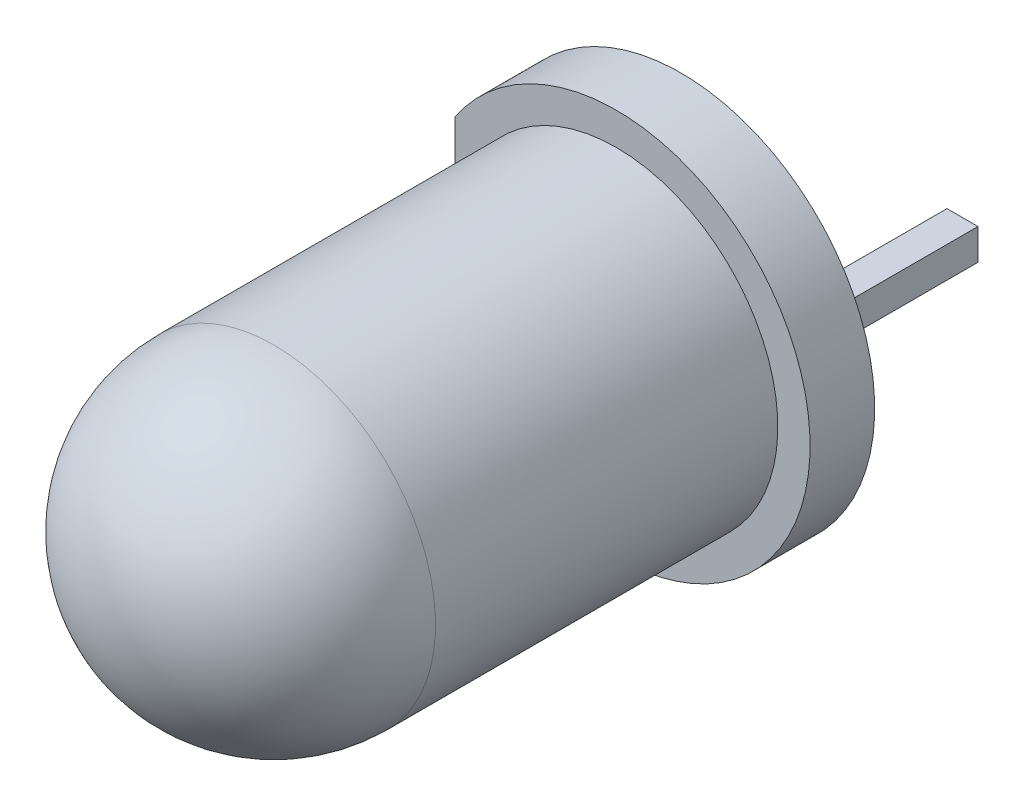
ISO-10303-21;
HEADER;
FILE_DESCRIPTION(('STEP AP214'),'2;1');
FILE_NAME('part.step','',(''),(''),'','','');
FILE_SCHEMA(('AUTOMOTIVE_DESIGN { 1 0 10303 214 1 1 1 1 }'));
ENDSEC;
DATA;
#1=APPLICATION_CONTEXT('core data for automotive mechanical design processes');
#2=APPLICATION_PROTOCOL_DEFINITION('international standard','automotive_design',2000,#1);
#3=PRODUCT_CONTEXT('',#1,'mechanical');
#4=PRODUCT('Part','Part','',(#3));
#5=PRODUCT_RELATED_PRODUCT_CATEGORY('part','',(#4));
#6=PRODUCT_DEFINITION_FORMATION('','',#4);
#7=PRODUCT_DEFINITION_CONTEXT('part definition',#1,'design');
#8=PRODUCT_DEFINITION('design','',#6,#7);
#9=PRODUCT_DEFINITION_SHAPE('','',#8);
#10=(LENGTH_UNIT() NAMED_UNIT(*) SI_UNIT(.MILLI.,.METRE.));
#11=(NAMED_UNIT(*) PLANE_ANGLE_UNIT() SI_UNIT($,.RADIAN.));
#12=(NAMED_UNIT(*) SI_UNIT($,.STERADIAN.) SOLID_ANGLE_UNIT());
#13=UNCERTAINTY_MEASURE_WITH_UNIT(LENGTH_MEASURE(1.E-05),#10,'distance_accuracy_value','');
#14=(GEOMETRIC_REPRESENTATION_CONTEXT(3) GLOBAL_UNCERTAINTY_ASSIGNED_CONTEXT((#13)) GLOBAL_UNIT_ASSIGNED_CONTEXT((#10,
#11,#12)) REPRESENTATION_CONTEXT('',''));
#15=CARTESIAN_POINT('',(0.,0.,0.));
#16=DIRECTION('',(0.,0.,1.));
#17=DIRECTION('',(1.,0.,0.));
#18=AXIS2_PLACEMENT_3D('',#15,#16,#17);
#19=CARTESIAN_POINT('',(-0.0499999999999997,0.,4.26666666666667));
#20=DIRECTION('',(0.,0.,1.));
#21=DIRECTION('',(-1.,0.,0.));
#22=AXIS2_PLACEMENT_3D('',#19,#20,#21);
#23=SPHERICAL_SURFACE('',#22,0.566666666666667);
#24=CARTESIAN_POINT('',(-0.0499999999999997,-0.24,4.26666666666667));
#25=DIRECTION('',(0.,1.,0.));
#26=DIRECTION('',(0.,0.,1.));
#27=AXIS2_PLACEMENT_3D('',#24,#25,#26);
#28=CIRCLE('',#27,0.513333333333333);
#29=CARTESIAN_POINT('',(-0.488634243989226,-0.24,4.));
#30=VERTEX_POINT('',#29);
#31=CARTESIAN_POINT('',(0.388634243989226,-0.24,4.));
#32=VERTEX_POINT('',#31);
#33=EDGE_CURVE('E161',#30,#32,#28,.F.);
#34=ORIENTED_EDGE('',*,*,#33,.T.);
#35=CARTESIAN_POINT('',(-0.0499999999999997,0.,4.));
#36=DIRECTION('',(0.,0.,1.));
#37=DIRECTION('',(1.,0.,0.));
#38=AXIS2_PLACEMENT_3D('',#35,#36,#37);
#39=CIRCLE('',#38,0.5);
#40=EDGE_CURVE('E56',#30,#32,#39,.T.);
#41=ORIENTED_EDGE('',*,*,#40,.F.);
#42=EDGE_LOOP('',(#34,#41));
#43=FACE_BOUND('',#42,.T.);
#44=ADVANCED_FACE('F48',(#43),#23,.T.);
#45=CARTESIAN_POINT('',(0.388634243989226,0.24,4.));
#46=VERTEX_POINT('',#45);
#47=CARTESIAN_POINT('',(-0.488634243989226,0.24,4.));
#48=VERTEX_POINT('',#47);
#49=EDGE_CURVE('E12',#46,#48,#39,.T.);
#50=ORIENTED_EDGE('',*,*,#49,.F.);
#51=CARTESIAN_POINT('',(-0.0499999999999997,0.24,4.26666666666667));
#52=DIRECTION('',(0.,1.,0.));
#53=DIRECTION('',(0.,0.,1.));
#54=AXIS2_PLACEMENT_3D('',#51,#52,#53);
#55=CIRCLE('',#54,0.513333333333333);
#56=EDGE_CURVE('E183',#48,#46,#55,.F.);
#57=ORIENTED_EDGE('',*,*,#56,.F.);
#58=EDGE_LOOP('',(#50,#57));
#59=FACE_BOUND('',#58,.T.);
#60=ADVANCED_FACE('F50',(#59),#23,.T.);
#61=CARTESIAN_POINT('',(-0.55,0.,4.));
#62=DIRECTION('',(0.,0.,-1.));
#63=DIRECTION('',(-1.,0.,0.));
#64=AXIS2_PLACEMENT_3D('',#61,#62,#63);
#65=PLANE('',#64);
#66=CARTESIAN_POINT('',(-0.0499999999999997,0.,4.));
#67=DIRECTION('',(0.,0.,1.));
#68=DIRECTION('',(1.,0.,0.));
#69=AXIS2_PLACEMENT_3D('',#66,#67,#68);
#70=CIRCLE('',#69,0.2);
#71=CARTESIAN_POINT('',(0.15,0.,4.));
#72=VERTEX_POINT('',#71);
#73=EDGE_CURVE('E256',#72,#72,#70,.T.);
#74=ORIENTED_EDGE('',*,*,#73,.F.);
#75=EDGE_LOOP('',(#74));
#76=FACE_BOUND('',#75,.T.);
#77=ORIENTED_EDGE('',*,*,#49,.T.);
#78=DIRECTION('',(1.,0.,0.));
#79=VECTOR('',#78,1.);
#80=CARTESIAN_POINT('',(-1.3,0.24,4.));
#81=LINE('',#80,#79);
#82=CARTESIAN_POINT('',(-1.3,0.24,4.));
#83=VERTEX_POINT('',#82);
#84=EDGE_CURVE('E102',#83,#48,#81,.T.);
#85=ORIENTED_EDGE('',*,*,#84,.F.);
#86=DIRECTION('',(0.,-1.,0.));
#87=VECTOR('',#86,1.);
#88=CARTESIAN_POINT('',(-1.3,0.24,4.));
#89=LINE('',#88,#87);
#90=CARTESIAN_POINT('',(-1.3,-0.24,4.));
#91=VERTEX_POINT('',#90);
#92=EDGE_CURVE('E160',#83,#91,#89,.T.);
#93=ORIENTED_EDGE('',*,*,#92,.T.);
#94=DIRECTION('',(1.,0.,0.));
#95=VECTOR('',#94,1.);
#96=CARTESIAN_POINT('',(-1.3,-0.24,4.));
#97=LINE('',#96,#95);
#98=EDGE_CURVE('E63',#91,#30,#97,.T.);
#99=ORIENTED_EDGE('',*,*,#98,.T.);
#100=ORIENTED_EDGE('',*,*,#40,.T.);
#101=CARTESIAN_POINT('',(1.2,-0.24,4.));
#102=VERTEX_POINT('',#101);
#103=EDGE_CURVE('E146',#32,#102,#97,.T.);
#104=ORIENTED_EDGE('',*,*,#103,.T.);
#105=DIRECTION('',(0.,-1.,0.));
#106=VECTOR('',#105,1.);
#107=CARTESIAN_POINT('',(1.2,0.24,4.));
#108=LINE('',#107,#106);
#109=CARTESIAN_POINT('',(1.2,0.24,4.));
#110=VERTEX_POINT('',#109);
#111=EDGE_CURVE('E130',#110,#102,#108,.T.);
#112=ORIENTED_EDGE('',*,*,#111,.F.);
#113=EDGE_CURVE('E118',#46,#110,#81,.T.);
#114=ORIENTED_EDGE('',*,*,#113,.F.);
#115=EDGE_LOOP('',(#77,#85,#93,#99,#100,#104,#112,#114));
#116=FACE_BOUND('',#115,.T.);
#117=ADVANCED_FACE('F166',(#76,#116),#65,.F.);
#118=CARTESIAN_POINT('',(0.,0.24,0.));
#119=DIRECTION('',(0.,1.,0.));
#120=DIRECTION('',(0.,0.,1.));
#121=AXIS2_PLACEMENT_3D('',#118,#119,#120);
#122=PLANE('',#121);
#123=ORIENTED_EDGE('',*,*,#84,.T.);
#124=ORIENTED_EDGE('',*,*,#56,.T.);
#125=ORIENTED_EDGE('',*,*,#113,.T.);
#126=DIRECTION('',(-0.508148861978286,0.,-0.861269257590315));
#127=VECTOR('',#126,1.);
#128=CARTESIAN_POINT('',(1.2,0.24,4.));
#129=LINE('',#128,#127);
#130=CARTESIAN_POINT('',(0.0199999999999998,0.24,2.));
#131=VERTEX_POINT('',#130);
#132=EDGE_CURVE('E109',#110,#131,#129,.T.);
#133=ORIENTED_EDGE('',*,*,#132,.T.);
#134=DIRECTION('',(-1.,0.,0.));
#135=VECTOR('',#134,1.);
#136=CARTESIAN_POINT('',(0.0199999999999998,0.24,2.));
#137=LINE('',#136,#135);
#138=CARTESIAN_POINT('',(-1.12,0.24,2.));
#139=VERTEX_POINT('',#138);
#140=EDGE_CURVE('E114',#131,#139,#137,.T.);
#141=ORIENTED_EDGE('',*,*,#140,.T.);
#142=DIRECTION('',(0.,0.,-1.));
#143=VECTOR('',#142,1.);
#144=CARTESIAN_POINT('',(-1.12,0.24,2.));
#145=LINE('',#144,#143);
#146=CARTESIAN_POINT('',(-1.12,0.24,-0.999999999999997));
#147=VERTEX_POINT('',#146);
#148=EDGE_CURVE('E136',#139,#147,#145,.T.);
#149=ORIENTED_EDGE('',*,*,#148,.T.);
#150=DIRECTION('',(1.,0.,0.));
#151=VECTOR('',#150,1.);
#152=CARTESIAN_POINT('',(-1.12,0.24,-0.999999999999997));
#153=LINE('',#152,#151);
#154=CARTESIAN_POINT('',(-1.6,0.24,-0.999999999999997));
#155=VERTEX_POINT('',#154);
#156=EDGE_CURVE('E147',#155,#147,#153,.T.);
#157=ORIENTED_EDGE('',*,*,#156,.F.);
#158=DIRECTION('',(0.,0.,1.));
#159=VECTOR('',#158,1.);
#160=CARTESIAN_POINT('',(-1.6,0.24,0.));
#161=LINE('',#160,#159);
#162=CARTESIAN_POINT('',(-1.6,0.24,3.5));
#163=VERTEX_POINT('',#162);
#164=EDGE_CURVE('E72',#155,#163,#161,.T.);
#165=ORIENTED_EDGE('',*,*,#164,.T.);
#166=DIRECTION('',(0.514495755427526,0.,0.857492925712544));
#167=VECTOR('',#166,1.);
#168=CARTESIAN_POINT('',(-1.6,0.24,3.5));
#169=LINE('',#168,#167);
#170=EDGE_CURVE('E156',#163,#83,#169,.T.);
#171=ORIENTED_EDGE('',*,*,#170,.T.);
#172=EDGE_LOOP('',(#123,#124,#125,#133,#141,#149,#157,#165,#171));
#173=FACE_BOUND('',#172,.T.);
#174=ADVANCED_FACE('F111',(#173),#122,.T.);
#175=CARTESIAN_POINT('',(0.,-0.24,0.));
#176=DIRECTION('',(0.,1.,0.));
#177=DIRECTION('',(0.,0.,1.));
#178=AXIS2_PLACEMENT_3D('',#175,#176,#177);
#179=PLANE('',#178);
#180=ORIENTED_EDGE('',*,*,#33,.F.);
#181=ORIENTED_EDGE('',*,*,#98,.F.);
#182=DIRECTION('',(0.514495755427526,0.,0.857492925712544));
#183=VECTOR('',#182,1.);
#184=CARTESIAN_POINT('',(-1.6,-0.24,3.5));
#185=LINE('',#184,#183);
#186=CARTESIAN_POINT('',(-1.6,-0.24,3.5));
#187=VERTEX_POINT('',#186);
#188=EDGE_CURVE('E143',#187,#91,#185,.T.);
#189=ORIENTED_EDGE('',*,*,#188,.F.);
#190=DIRECTION('',(0.,0.,1.));
#191=VECTOR('',#190,1.);
#192=CARTESIAN_POINT('',(-1.6,-0.24,0.));
#193=LINE('',#192,#191);
#194=CARTESIAN_POINT('',(-1.6,-0.24,-0.999999999999997));
#195=VERTEX_POINT('',#194);
#196=EDGE_CURVE('E96',#195,#187,#193,.T.);
#197=ORIENTED_EDGE('',*,*,#196,.F.);
#198=DIRECTION('',(-1.,0.,0.));
#199=VECTOR('',#198,1.);
#200=CARTESIAN_POINT('',(-1.12,-0.24,-0.999999999999997));
#201=LINE('',#200,#199);
#202=CARTESIAN_POINT('',(-1.12,-0.24,-0.999999999999997));
#203=VERTEX_POINT('',#202);
#204=EDGE_CURVE('E204',#203,#195,#201,.T.);
#205=ORIENTED_EDGE('',*,*,#204,.F.);
#206=DIRECTION('',(0.,0.,-1.));
#207=VECTOR('',#206,1.);
#208=CARTESIAN_POINT('',(-1.12,-0.24,2.));
#209=LINE('',#208,#207);
#210=CARTESIAN_POINT('',(-1.12,-0.24,2.));
#211=VERTEX_POINT('',#210);
#212=EDGE_CURVE('E152',#211,#203,#209,.T.);
#213=ORIENTED_EDGE('',*,*,#212,.F.);
#214=DIRECTION('',(-1.,0.,0.));
#215=VECTOR('',#214,1.);
#216=CARTESIAN_POINT('',(0.0199999999999998,-0.24,2.));
#217=LINE('',#216,#215);
#218=CARTESIAN_POINT('',(0.0199999999999998,-0.24,2.));
#219=VERTEX_POINT('',#218);
#220=EDGE_CURVE('E150',#219,#211,#217,.T.);
#221=ORIENTED_EDGE('',*,*,#220,.F.);
#222=DIRECTION('',(-0.508148861978286,0.,-0.861269257590315));
#223=VECTOR('',#222,1.);
#224=CARTESIAN_POINT('',(1.2,-0.24,4.));
#225=LINE('',#224,#223);
#226=EDGE_CURVE('E127',#102,#219,#225,.T.);
#227=ORIENTED_EDGE('',*,*,#226,.F.);
#228=ORIENTED_EDGE('',*,*,#103,.F.);
#229=EDGE_LOOP('',(#180,#181,#189,#197,#205,#213,#221,#227,#228));
#230=FACE_BOUND('',#229,.T.);
#231=ADVANCED_FACE('F218',(#230),#179,.F.);
#232=CARTESIAN_POINT('',(-1.6,0.24,3.5));
#233=DIRECTION('',(0.857492925712544,0.,-0.514495755427526));
#234=DIRECTION('',(-0.514495755427526,0.,-0.857492925712544));
#235=AXIS2_PLACEMENT_3D('',#232,#233,#234);
#236=PLANE('',#235);
#237=ORIENTED_EDGE('',*,*,#188,.T.);
#238=ORIENTED_EDGE('',*,*,#92,.F.);
#239=ORIENTED_EDGE('',*,*,#170,.F.);
#240=DIRECTION('',(0.,-1.,0.));
#241=VECTOR('',#240,1.);
#242=CARTESIAN_POINT('',(-1.6,0.24,3.5));
#243=LINE('',#242,#241);
#244=EDGE_CURVE('E142',#163,#187,#243,.T.);
#245=ORIENTED_EDGE('',*,*,#244,.T.);
#246=EDGE_LOOP('',(#237,#238,#239,#245));
#247=FACE_BOUND('',#246,.T.);
#248=ADVANCED_FACE('F215',(#247),#236,.F.);
#249=CARTESIAN_POINT('',(1.2,0.24,4.));
#250=DIRECTION('',(-0.861269257590315,0.,0.508148861978286));
#251=DIRECTION('',(0.508148861978286,0.,0.861269257590315));
#252=AXIS2_PLACEMENT_3D('',#249,#250,#251);
#253=PLANE('',#252);
#254=ORIENTED_EDGE('',*,*,#226,.T.);
#255=DIRECTION('',(0.,-1.,0.));
#256=VECTOR('',#255,1.);
#257=CARTESIAN_POINT('',(0.0199999999999998,0.24,2.));
#258=LINE('',#257,#256);
#259=EDGE_CURVE('E124',#131,#219,#258,.T.);
#260=ORIENTED_EDGE('',*,*,#259,.F.);
#261=ORIENTED_EDGE('',*,*,#132,.F.);
#262=ORIENTED_EDGE('',*,*,#111,.T.);
#263=EDGE_LOOP('',(#254,#260,#261,#262));
#264=FACE_BOUND('',#263,.T.);
#265=ADVANCED_FACE('F125',(#264),#253,.F.);
#266=CARTESIAN_POINT('',(0.0199999999999998,0.24,2.));
#267=DIRECTION('',(0.,0.,1.));
#268=DIRECTION('',(1.,0.,0.));
#269=AXIS2_PLACEMENT_3D('',#266,#267,#268);
#270=PLANE('',#269);
#271=ORIENTED_EDGE('',*,*,#220,.T.);
#272=DIRECTION('',(0.,-1.,0.));
#273=VECTOR('',#272,1.);
#274=CARTESIAN_POINT('',(-1.12,0.24,2.));
#275=LINE('',#274,#273);
#276=EDGE_CURVE('E131',#139,#211,#275,.T.);
#277=ORIENTED_EDGE('',*,*,#276,.F.);
#278=ORIENTED_EDGE('',*,*,#140,.F.);
#279=ORIENTED_EDGE('',*,*,#259,.T.);
#280=EDGE_LOOP('',(#271,#277,#278,#279));
#281=FACE_BOUND('',#280,.T.);
#282=ADVANCED_FACE('F133',(#281),#270,.F.);
#283=CARTESIAN_POINT('',(-1.12,0.24,2.));
#284=DIRECTION('',(-1.,0.,0.));
#285=DIRECTION('',(0.,0.,1.));
#286=AXIS2_PLACEMENT_3D('',#283,#284,#285);
#287=PLANE('',#286);
#288=ORIENTED_EDGE('',*,*,#212,.T.);
#289=DIRECTION('',(0.,-1.,0.));
#290=VECTOR('',#289,1.);
#291=CARTESIAN_POINT('',(-1.12,-0.24,-0.999999999999997));
#292=LINE('',#291,#290);
#293=EDGE_CURVE('E198',#147,#203,#292,.T.);
#294=ORIENTED_EDGE('',*,*,#293,.F.);
#295=ORIENTED_EDGE('',*,*,#148,.F.);
#296=ORIENTED_EDGE('',*,*,#276,.T.);
#297=EDGE_LOOP('',(#288,#294,#295,#296));
#298=FACE_BOUND('',#297,.T.);
#299=ADVANCED_FACE('F201',(#298),#287,.F.);
#300=CARTESIAN_POINT('',(-1.6,0.24,0.));
#301=DIRECTION('',(1.,0.,0.));
#302=DIRECTION('',(0.,0.,-1.));
#303=AXIS2_PLACEMENT_3D('',#300,#301,#302);
#304=PLANE('',#303);
#305=ORIENTED_EDGE('',*,*,#196,.T.);
#306=ORIENTED_EDGE('',*,*,#244,.F.);
#307=ORIENTED_EDGE('',*,*,#164,.F.);
#308=DIRECTION('',(0.,1.,0.));
#309=VECTOR('',#308,1.);
#310=CARTESIAN_POINT('',(-1.6,-0.24,-0.999999999999997));
#311=LINE('',#310,#309);
#312=EDGE_CURVE('E199',#195,#155,#311,.T.);
#313=ORIENTED_EDGE('',*,*,#312,.F.);
#314=EDGE_LOOP('',(#305,#306,#307,#313));
#315=FACE_BOUND('',#314,.T.);
#316=ADVANCED_FACE('F219',(#315),#304,.F.);
#317=CARTESIAN_POINT('',(0.,0.,-0.999999999999997));
#318=DIRECTION('',(0.,0.,1.));
#319=DIRECTION('',(1.,0.,0.));
#320=AXIS2_PLACEMENT_3D('',#317,#318,#319);
#321=PLANE('',#320);
#322=ORIENTED_EDGE('',*,*,#293,.T.);
#323=ORIENTED_EDGE('',*,*,#204,.T.);
#324=ORIENTED_EDGE('',*,*,#312,.T.);
#325=ORIENTED_EDGE('',*,*,#156,.T.);
#326=EDGE_LOOP('',(#322,#323,#324,#325));
#327=FACE_BOUND('',#326,.T.);
#328=ADVANCED_FACE('F196',(#327),#321,.F.);
#329=CARTESIAN_POINT('',(-0.0499999999999997,0.,3.9));
#330=DIRECTION('',(0.,0.,1.));
#331=DIRECTION('',(1.,0.,0.));
#332=AXIS2_PLACEMENT_3D('',#329,#330,#331);
#333=CYLINDRICAL_SURFACE('',#332,0.2);
#334=CARTESIAN_POINT('',(-0.0499999999999997,0.,3.9));
#335=DIRECTION('',(0.,0.,1.));
#336=DIRECTION('',(1.,0.,0.));
#337=AXIS2_PLACEMENT_3D('',#334,#335,#336);
#338=CIRCLE('',#337,0.2);
#339=CARTESIAN_POINT('',(0.15,0.,3.9));
#340=VERTEX_POINT('',#339);
#341=EDGE_CURVE('E207',#340,#340,#338,.T.);
#342=ORIENTED_EDGE('',*,*,#341,.F.);
#343=EDGE_LOOP('',(#342));
#344=FACE_BOUND('',#343,.T.);
#345=ORIENTED_EDGE('',*,*,#73,.T.);
#346=EDGE_LOOP('',(#345));
#347=FACE_BOUND('',#346,.T.);
#348=ADVANCED_FACE('F226',(#344,#347),#333,.F.);
#349=CARTESIAN_POINT('',(-0.0499999999999997,0.,3.9));
#350=DIRECTION('',(0.,0.,1.));
#351=DIRECTION('',(1.,0.,0.));
#352=AXIS2_PLACEMENT_3D('',#349,#350,#351);
#353=PLANE('',#352);
#354=ORIENTED_EDGE('',*,*,#341,.T.);
#355=EDGE_LOOP('',(#354));
#356=FACE_BOUND('',#355,.T.);
#357=ADVANCED_FACE('F248',(#356),#353,.T.);
#358=CLOSED_SHELL('',(#44,#60,#117,#174,#231,#248,#265,#282,#299,#316,#328,#348,#357));
#359=MANIFOLD_SOLID_BREP('B2',#358);
#360=CARTESIAN_POINT('',(1.12,0.24,2.));
#361=DIRECTION('',(0.,0.,1.));
#362=DIRECTION('',(1.,0.,0.));
#363=AXIS2_PLACEMENT_3D('',#360,#361,#362);
#364=PLANE('',#363);
#365=DIRECTION('',(-1.,0.,0.));
#366=VECTOR('',#365,1.);
#367=CARTESIAN_POINT('',(1.12,-0.24,2.));
#368=LINE('',#367,#366);
#369=CARTESIAN_POINT('',(1.12,-0.24,2.));
#370=VERTEX_POINT('',#369);
#371=CARTESIAN_POINT('',(0.22,-0.24,2.));
#372=VERTEX_POINT('',#371);
#373=EDGE_CURVE('E454',#370,#372,#368,.T.);
#374=ORIENTED_EDGE('',*,*,#373,.T.);
#375=DIRECTION('',(0.,-1.,0.));
#376=VECTOR('',#375,1.);
#377=CARTESIAN_POINT('',(0.22,0.24,2.));
#378=LINE('',#377,#376);
#379=CARTESIAN_POINT('',(0.22,0.24,2.));
#380=VERTEX_POINT('',#379);
#381=EDGE_CURVE('E46',#380,#372,#378,.T.);
#382=ORIENTED_EDGE('',*,*,#381,.F.);
#383=DIRECTION('',(-1.,0.,0.));
#384=VECTOR('',#383,1.);
#385=CARTESIAN_POINT('',(1.12,0.24,2.));
#386=LINE('',#385,#384);
#387=CARTESIAN_POINT('',(1.12,0.24,2.));
#388=VERTEX_POINT('',#387);
#389=EDGE_CURVE('E455',#388,#380,#386,.T.);
#390=ORIENTED_EDGE('',*,*,#389,.F.);
#391=DIRECTION('',(0.,-1.,0.));
#392=VECTOR('',#391,1.);
#393=CARTESIAN_POINT('',(1.12,0.24,2.));
#394=LINE('',#393,#392);
#395=EDGE_CURVE('E460',#388,#370,#394,.T.);
#396=ORIENTED_EDGE('',*,*,#395,.T.);
#397=EDGE_LOOP('',(#374,#382,#390,#396));
#398=FACE_BOUND('',#397,.T.);
#399=ADVANCED_FACE('F368',(#398),#364,.F.);
#400=CARTESIAN_POINT('',(0.22,0.24,2.));
#401=DIRECTION('',(0.861269257590315,0.,-0.508148861978286));
#402=DIRECTION('',(-0.508148861978286,0.,-0.861269257590315));
#403=AXIS2_PLACEMENT_3D('',#400,#401,#402);
#404=PLANE('',#403);
#405=DIRECTION('',(0.508148861978286,0.,0.861269257590315));
#406=VECTOR('',#405,1.);
#407=CARTESIAN_POINT('',(0.22,-0.24,2.));
#408=LINE('',#407,#406);
#409=CARTESIAN_POINT('',(1.4,-0.24,4.));
#410=VERTEX_POINT('',#409);
#411=EDGE_CURVE('E463',#372,#410,#408,.T.);
#412=ORIENTED_EDGE('',*,*,#411,.T.);
#413=DIRECTION('',(0.,-1.,0.));
#414=VECTOR('',#413,1.);
#415=CARTESIAN_POINT('',(1.4,0.24,4.));
#416=LINE('',#415,#414);
#417=CARTESIAN_POINT('',(1.4,0.24,4.));
#418=VERTEX_POINT('',#417);
#419=EDGE_CURVE('E376',#418,#410,#416,.T.);
#420=ORIENTED_EDGE('',*,*,#419,.F.);
#421=DIRECTION('',(0.508148861978286,0.,0.861269257590315));
#422=VECTOR('',#421,1.);
#423=CARTESIAN_POINT('',(0.22,0.24,2.));
#424=LINE('',#423,#422);
#425=EDGE_CURVE('E417',#380,#418,#424,.T.);
#426=ORIENTED_EDGE('',*,*,#425,.F.);
#427=ORIENTED_EDGE('',*,*,#381,.T.);
#428=EDGE_LOOP('',(#412,#420,#426,#427));
#429=FACE_BOUND('',#428,.T.);
#430=ADVANCED_FACE('F478',(#429),#404,.F.);
#431=CARTESIAN_POINT('',(1.4,0.24,4.));
#432=DIRECTION('',(0.,0.,-1.));
#433=DIRECTION('',(-1.,0.,0.));
#434=AXIS2_PLACEMENT_3D('',#431,#432,#433);
#435=PLANE('',#434);
#436=DIRECTION('',(1.,0.,0.));
#437=VECTOR('',#436,1.);
#438=CARTESIAN_POINT('',(1.4,-0.24,4.));
#439=LINE('',#438,#437);
#440=CARTESIAN_POINT('',(1.6,-0.24,4.));
#441=VERTEX_POINT('',#440);
#442=EDGE_CURVE('E403',#410,#441,#439,.T.);
#443=ORIENTED_EDGE('',*,*,#442,.T.);
#444=DIRECTION('',(0.,-1.,0.));
#445=VECTOR('',#444,1.);
#446=CARTESIAN_POINT('',(1.6,0.24,4.));
#447=LINE('',#446,#445);
#448=CARTESIAN_POINT('',(1.6,0.24,4.));
#449=VERTEX_POINT('',#448);
#450=EDGE_CURVE('E469',#449,#441,#447,.T.);
#451=ORIENTED_EDGE('',*,*,#450,.F.);
#452=DIRECTION('',(1.,0.,0.));
#453=VECTOR('',#452,1.);
#454=CARTESIAN_POINT('',(1.4,0.24,4.));
#455=LINE('',#454,#453);
#456=EDGE_CURVE('E434',#418,#449,#455,.T.);
#457=ORIENTED_EDGE('',*,*,#456,.F.);
#458=ORIENTED_EDGE('',*,*,#419,.T.);
#459=EDGE_LOOP('',(#443,#451,#457,#458));
#460=FACE_BOUND('',#459,.T.);
#461=ADVANCED_FACE('F470',(#460),#435,.F.);
#462=CARTESIAN_POINT('',(1.6,0.24,4.));
#463=DIRECTION('',(-1.,0.,0.));
#464=DIRECTION('',(0.,0.,1.));
#465=AXIS2_PLACEMENT_3D('',#462,#463,#464);
#466=PLANE('',#465);
#467=DIRECTION('',(0.,0.,-1.));
#468=VECTOR('',#467,1.);
#469=CARTESIAN_POINT('',(1.6,-0.24,4.));
#470=LINE('',#469,#468);
#471=CARTESIAN_POINT('',(1.6,-0.24,-3.));
#472=VERTEX_POINT('',#471);
#473=EDGE_CURVE('E441',#441,#472,#470,.T.);
#474=ORIENTED_EDGE('',*,*,#473,.T.);
#475=DIRECTION('',(0.,-1.,0.));
#476=VECTOR('',#475,1.);
#477=CARTESIAN_POINT('',(1.6,0.24,-3.));
#478=LINE('',#477,#476);
#479=CARTESIAN_POINT('',(1.6,0.24,-3.));
#480=VERTEX_POINT('',#479);
#481=EDGE_CURVE('E438',#480,#472,#478,.T.);
#482=ORIENTED_EDGE('',*,*,#481,.F.);
#483=DIRECTION('',(0.,0.,-1.));
#484=VECTOR('',#483,1.);
#485=CARTESIAN_POINT('',(1.6,0.24,4.));
#486=LINE('',#485,#484);
#487=EDGE_CURVE('E428',#449,#480,#486,.T.);
#488=ORIENTED_EDGE('',*,*,#487,.F.);
#489=ORIENTED_EDGE('',*,*,#450,.T.);
#490=EDGE_LOOP('',(#474,#482,#488,#489));
#491=FACE_BOUND('',#490,.T.);
#492=ADVANCED_FACE('F439',(#491),#466,.F.);
#493=CARTESIAN_POINT('',(1.12,0.24,0.));
#494=DIRECTION('',(1.,0.,0.));
#495=DIRECTION('',(0.,0.,-1.));
#496=AXIS2_PLACEMENT_3D('',#493,#494,#495);
#497=PLANE('',#496);
#498=DIRECTION('',(0.,0.,1.));
#499=VECTOR('',#498,1.);
#500=CARTESIAN_POINT('',(1.12,-0.24,0.));
#501=LINE('',#500,#499);
#502=CARTESIAN_POINT('',(1.12,-0.24,-3.));
#503=VERTEX_POINT('',#502);
#504=EDGE_CURVE('E410',#503,#370,#501,.T.);
#505=ORIENTED_EDGE('',*,*,#504,.T.);
#506=ORIENTED_EDGE('',*,*,#395,.F.);
#507=DIRECTION('',(0.,0.,1.));
#508=VECTOR('',#507,1.);
#509=CARTESIAN_POINT('',(1.12,0.24,0.));
#510=LINE('',#509,#508);
#511=CARTESIAN_POINT('',(1.12,0.24,-3.));
#512=VERTEX_POINT('',#511);
#513=EDGE_CURVE('E384',#512,#388,#510,.T.);
#514=ORIENTED_EDGE('',*,*,#513,.F.);
#515=DIRECTION('',(0.,1.,0.));
#516=VECTOR('',#515,1.);
#517=CARTESIAN_POINT('',(1.12,-0.24,-3.));
#518=LINE('',#517,#516);
#519=EDGE_CURVE('E449',#503,#512,#518,.T.);
#520=ORIENTED_EDGE('',*,*,#519,.F.);
#521=EDGE_LOOP('',(#505,#506,#514,#520));
#522=FACE_BOUND('',#521,.T.);
#523=ADVANCED_FACE('F474',(#522),#497,.F.);
#524=CARTESIAN_POINT('',(0.,0.24,0.));
#525=DIRECTION('',(0.,-1.,0.));
#526=DIRECTION('',(0.,0.,-1.));
#527=AXIS2_PLACEMENT_3D('',#524,#525,#526);
#528=PLANE('',#527);
#529=ORIENTED_EDGE('',*,*,#389,.T.);
#530=ORIENTED_EDGE('',*,*,#425,.T.);
#531=ORIENTED_EDGE('',*,*,#456,.T.);
#532=ORIENTED_EDGE('',*,*,#487,.T.);
#533=DIRECTION('',(1.,0.,0.));
#534=VECTOR('',#533,1.);
#535=CARTESIAN_POINT('',(1.12,0.24,-3.));
#536=LINE('',#535,#534);
#537=EDGE_CURVE('E432',#512,#480,#536,.T.);
#538=ORIENTED_EDGE('',*,*,#537,.F.);
#539=ORIENTED_EDGE('',*,*,#513,.T.);
#540=EDGE_LOOP('',(#529,#530,#531,#532,#538,#539));
#541=FACE_BOUND('',#540,.T.);
#542=ADVANCED_FACE('F430',(#541),#528,.F.);
#543=CARTESIAN_POINT('',(0.,-0.24,0.));
#544=DIRECTION('',(0.,-1.,0.));
#545=DIRECTION('',(0.,0.,-1.));
#546=AXIS2_PLACEMENT_3D('',#543,#544,#545);
#547=PLANE('',#546);
#548=ORIENTED_EDGE('',*,*,#373,.F.);
#549=ORIENTED_EDGE('',*,*,#504,.F.);
#550=DIRECTION('',(-1.,0.,0.));
#551=VECTOR('',#550,1.);
#552=CARTESIAN_POINT('',(1.6,-0.24,-3.));
#553=LINE('',#552,#551);
#554=EDGE_CURVE('E445',#472,#503,#553,.T.);
#555=ORIENTED_EDGE('',*,*,#554,.F.);
#556=ORIENTED_EDGE('',*,*,#473,.F.);
#557=ORIENTED_EDGE('',*,*,#442,.F.);
#558=ORIENTED_EDGE('',*,*,#411,.F.);
#559=EDGE_LOOP('',(#548,#549,#555,#556,#557,#558));
#560=FACE_BOUND('',#559,.T.);
#561=ADVANCED_FACE('F473',(#560),#547,.T.);
#562=CARTESIAN_POINT('',(0.,0.,-3.));
#563=DIRECTION('',(0.,0.,-1.));
#564=DIRECTION('',(-1.,0.,0.));
#565=AXIS2_PLACEMENT_3D('',#562,#563,#564);
#566=PLANE('',#565);
#567=ORIENTED_EDGE('',*,*,#537,.T.);
#568=ORIENTED_EDGE('',*,*,#481,.T.);
#569=ORIENTED_EDGE('',*,*,#554,.T.);
#570=ORIENTED_EDGE('',*,*,#519,.T.);
#571=EDGE_LOOP('',(#567,#568,#569,#570));
#572=FACE_BOUND('',#571,.T.);
#573=ADVANCED_FACE('F448',(#572),#566,.T.);
#574=CLOSED_SHELL('',(#399,#430,#461,#492,#523,#542,#561,#573));
#575=MANIFOLD_SOLID_BREP('B6',#574);
#576=CARTESIAN_POINT('',(0.,0.,1.));
#577=DIRECTION('',(0.,0.,-1.));
#578=DIRECTION('',(-1.,0.,0.));
#579=AXIS2_PLACEMENT_3D('',#576,#577,#578);
#580=CYLINDRICAL_SURFACE('',#579,3.);
#581=CARTESIAN_POINT('',(0.,0.,1.));
#582=DIRECTION('',(0.,0.,1.));
#583=DIRECTION('',(1.,0.,0.));
#584=AXIS2_PLACEMENT_3D('',#581,#582,#583);
#585=CIRCLE('',#584,3.);
#586=CARTESIAN_POINT('',(-2.5,-1.6583123951777,1.));
#587=VERTEX_POINT('',#586);
#588=CARTESIAN_POINT('',(-2.5,1.6583123951777,1.));
#589=VERTEX_POINT('',#588);
#590=EDGE_CURVE('E580',#587,#589,#585,.T.);
#591=ORIENTED_EDGE('',*,*,#590,.F.);
#592=DIRECTION('',(0.,0.,-1.));
#593=VECTOR('',#592,1.);
#594=CARTESIAN_POINT('',(-2.5,-1.6583123951777,4.35410196624969));
#595=LINE('',#594,#593);
#596=CARTESIAN_POINT('',(-2.5,-1.6583123951777,0.));
#597=VERTEX_POINT('',#596);
#598=EDGE_CURVE('E778',#587,#597,#595,.T.);
#599=ORIENTED_EDGE('',*,*,#598,.T.);
#600=CARTESIAN_POINT('',(0.,0.,0.));
#601=DIRECTION('',(0.,0.,1.));
#602=DIRECTION('',(1.,0.,0.));
#603=AXIS2_PLACEMENT_3D('',#600,#601,#602);
#604=CIRCLE('',#603,3.);
#605=CARTESIAN_POINT('',(-2.5,1.6583123951777,0.));
#606=VERTEX_POINT('',#605);
#607=EDGE_CURVE('E786',#597,#606,#604,.T.);
#608=ORIENTED_EDGE('',*,*,#607,.T.);
#609=DIRECTION('',(0.,0.,-1.));
#610=VECTOR('',#609,1.);
#611=CARTESIAN_POINT('',(-2.5,1.6583123951777,4.35410196624969));
#612=LINE('',#611,#610);
#613=EDGE_CURVE('E781',#589,#606,#612,.T.);
#614=ORIENTED_EDGE('',*,*,#613,.F.);
#615=EDGE_LOOP('',(#591,#599,#608,#614));
#616=FACE_BOUND('',#615,.T.);
#617=ADVANCED_FACE('F573',(#616),#580,.T.);
#618=CARTESIAN_POINT('',(0.,0.,1.));
#619=DIRECTION('',(0.,0.,1.));
#620=DIRECTION('',(1.,0.,0.));
#621=AXIS2_PLACEMENT_3D('',#618,#619,#620);
#622=PLANE('',#621);
#623=DIRECTION('',(0.,-1.,0.));
#624=VECTOR('',#623,1.);
#625=CARTESIAN_POINT('',(-2.5,1.6583123951777,1.));
#626=LINE('',#625,#624);
#627=CARTESIAN_POINT('',(-2.5,0.,1.));
#628=VERTEX_POINT('',#627);
#629=EDGE_CURVE('E774',#628,#587,#626,.T.);
#630=ORIENTED_EDGE('',*,*,#629,.T.);
#631=ORIENTED_EDGE('',*,*,#590,.T.);
#632=EDGE_CURVE('E775',#589,#628,#626,.T.);
#633=ORIENTED_EDGE('',*,*,#632,.T.);
#634=CARTESIAN_POINT('',(0.,0.,1.));
#635=DIRECTION('',(0.,0.,1.));
#636=DIRECTION('',(1.,0.,0.));
#637=AXIS2_PLACEMENT_3D('',#634,#635,#636);
#638=CIRCLE('',#637,2.5);
#639=EDGE_CURVE('E366',#628,#628,#638,.T.);
#640=ORIENTED_EDGE('',*,*,#639,.F.);
#641=EDGE_LOOP('',(#630,#631,#633,#640));
#642=FACE_BOUND('',#641,.T.);
#643=ADVANCED_FACE('F800',(#642),#622,.T.);
#644=CARTESIAN_POINT('',(0.,0.,0.));
#645=DIRECTION('',(0.,0.,1.));
#646=DIRECTION('',(1.,0.,0.));
#647=AXIS2_PLACEMENT_3D('',#644,#645,#646);
#648=PLANE('',#647);
#649=DIRECTION('',(0.,1.,0.));
#650=VECTOR('',#649,1.);
#651=CARTESIAN_POINT('',(1.12,-0.24,0.));
#652=LINE('',#651,#650);
#653=CARTESIAN_POINT('',(1.12,-0.24,0.));
#654=VERTEX_POINT('',#653);
#655=CARTESIAN_POINT('',(1.12,0.24,0.));
#656=VERTEX_POINT('',#655);
#657=EDGE_CURVE('E687',#654,#656,#652,.T.);
#658=ORIENTED_EDGE('',*,*,#657,.F.);
#659=DIRECTION('',(-1.,0.,0.));
#660=VECTOR('',#659,1.);
#661=CARTESIAN_POINT('',(1.12,-0.24,0.));
#662=LINE('',#661,#660);
#663=CARTESIAN_POINT('',(1.6,-0.24,0.));
#664=VERTEX_POINT('',#663);
#665=EDGE_CURVE('E694',#664,#654,#662,.T.);
#666=ORIENTED_EDGE('',*,*,#665,.F.);
#667=DIRECTION('',(0.,1.,0.));
#668=VECTOR('',#667,1.);
#669=CARTESIAN_POINT('',(1.6,-0.24,0.));
#670=LINE('',#669,#668);
#671=CARTESIAN_POINT('',(1.6,0.24,0.));
#672=VERTEX_POINT('',#671);
#673=EDGE_CURVE('E742',#664,#672,#670,.T.);
#674=ORIENTED_EDGE('',*,*,#673,.T.);
#675=DIRECTION('',(-1.,0.,0.));
#676=VECTOR('',#675,1.);
#677=CARTESIAN_POINT('',(1.12,0.24,0.));
#678=LINE('',#677,#676);
#679=EDGE_CURVE('E708',#672,#656,#678,.T.);
#680=ORIENTED_EDGE('',*,*,#679,.T.);
#681=EDGE_LOOP('',(#658,#666,#674,#680));
#682=FACE_BOUND('',#681,.T.);
#683=DIRECTION('',(0.,1.,0.));
#684=VECTOR('',#683,1.);
#685=CARTESIAN_POINT('',(-1.6,-0.24,0.));
#686=LINE('',#685,#684);
#687=CARTESIAN_POINT('',(-1.6,-0.24,0.));
#688=VERTEX_POINT('',#687);
#689=CARTESIAN_POINT('',(-1.6,0.24,0.));
#690=VERTEX_POINT('',#689);
#691=EDGE_CURVE('E738',#688,#690,#686,.T.);
#692=ORIENTED_EDGE('',*,*,#691,.F.);
#693=DIRECTION('',(-1.,0.,0.));
#694=VECTOR('',#693,1.);
#695=CARTESIAN_POINT('',(-1.6,-0.24,0.));
#696=LINE('',#695,#694);
#697=CARTESIAN_POINT('',(-1.12,-0.24,0.));
#698=VERTEX_POINT('',#697);
#699=EDGE_CURVE('E716',#698,#688,#696,.T.);
#700=ORIENTED_EDGE('',*,*,#699,.F.);
#701=DIRECTION('',(0.,1.,0.));
#702=VECTOR('',#701,1.);
#703=CARTESIAN_POINT('',(-1.12,-0.24,0.));
#704=LINE('',#703,#702);
#705=CARTESIAN_POINT('',(-1.12,0.24,0.));
#706=VERTEX_POINT('',#705);
#707=EDGE_CURVE('E758',#698,#706,#704,.T.);
#708=ORIENTED_EDGE('',*,*,#707,.T.);
#709=DIRECTION('',(-1.,0.,0.));
#710=VECTOR('',#709,1.);
#711=CARTESIAN_POINT('',(-1.6,0.24,0.));
#712=LINE('',#711,#710);
#713=EDGE_CURVE('E739',#706,#690,#712,.T.);
#714=ORIENTED_EDGE('',*,*,#713,.T.);
#715=EDGE_LOOP('',(#692,#700,#708,#714));
#716=FACE_BOUND('',#715,.T.);
#717=ORIENTED_EDGE('',*,*,#607,.F.);
#718=DIRECTION('',(0.,-1.,0.));
#719=VECTOR('',#718,1.);
#720=CARTESIAN_POINT('',(-2.5,1.6583123951777,0.));
#721=LINE('',#720,#719);
#722=EDGE_CURVE('E761',#606,#597,#721,.T.);
#723=ORIENTED_EDGE('',*,*,#722,.F.);
#724=EDGE_LOOP('',(#717,#723));
#725=FACE_BOUND('',#724,.T.);
#726=ADVANCED_FACE('F706',(#682,#716,#725),#648,.F.);
#727=CARTESIAN_POINT('',(0.,0.,6.3));
#728=DIRECTION('',(0.,0.,-1.));
#729=DIRECTION('',(0.,1.,0.));
#730=AXIS2_PLACEMENT_3D('',#727,#728,#729);
#731=SPHERICAL_SURFACE('',#730,2.5);
#732=CARTESIAN_POINT('',(0.,0.,6.3));
#733=DIRECTION('',(0.,0.,-1.));
#734=DIRECTION('',(0.,1.,0.));
#735=AXIS2_PLACEMENT_3D('',#732,#733,#734);
#736=CIRCLE('',#735,2.5);
#737=CARTESIAN_POINT('',(0.,2.5,6.3));
#738=VERTEX_POINT('',#737);
#739=EDGE_CURVE('E783',#738,#738,#736,.T.);
#740=ORIENTED_EDGE('',*,*,#739,.F.);
#741=EDGE_LOOP('',(#740));
#742=FACE_BOUND('',#741,.T.);
#743=ADVANCED_FACE('F804',(#742),#731,.T.);
#744=CARTESIAN_POINT('',(0.,0.,1.));
#745=DIRECTION('',(0.,0.,-1.));
#746=DIRECTION('',(0.,1.,0.));
#747=AXIS2_PLACEMENT_3D('',#744,#745,#746);
#748=CYLINDRICAL_SURFACE('',#747,2.5);
#749=ORIENTED_EDGE('',*,*,#739,.T.);
#750=EDGE_LOOP('',(#749));
#751=FACE_BOUND('',#750,.T.);
#752=ORIENTED_EDGE('',*,*,#639,.T.);
#753=EDGE_LOOP('',(#752));
#754=FACE_BOUND('',#753,.T.);
#755=ADVANCED_FACE('F802',(#751,#754),#748,.T.);
#756=CARTESIAN_POINT('',(-2.5,1.6583123951777,4.35410196624969));
#757=DIRECTION('',(1.,0.,0.));
#758=DIRECTION('',(0.,0.,-1.));
#759=AXIS2_PLACEMENT_3D('',#756,#757,#758);
#760=PLANE('',#759);
#761=ORIENTED_EDGE('',*,*,#613,.T.);
#762=ORIENTED_EDGE('',*,*,#722,.T.);
#763=ORIENTED_EDGE('',*,*,#598,.F.);
#764=ORIENTED_EDGE('',*,*,#629,.F.);
#765=ORIENTED_EDGE('',*,*,#632,.F.);
#766=EDGE_LOOP('',(#761,#762,#763,#764,#765));
#767=FACE_BOUND('',#766,.T.);
#768=ADVANCED_FACE('F796',(#767),#760,.F.);
#769=CARTESIAN_POINT('',(-1.12,-0.24,0.));
#770=DIRECTION('',(1.,0.,0.));
#771=DIRECTION('',(0.,0.,-1.));
#772=AXIS2_PLACEMENT_3D('',#769,#770,#771);
#773=PLANE('',#772);
#774=DIRECTION('',(0.,0.,-1.));
#775=VECTOR('',#774,1.);
#776=CARTESIAN_POINT('',(-1.12,0.24,0.));
#777=LINE('',#776,#775);
#778=CARTESIAN_POINT('',(-1.12,0.24,2.));
#779=VERTEX_POINT('',#778);
#780=EDGE_CURVE('E720',#779,#706,#777,.T.);
#781=ORIENTED_EDGE('',*,*,#780,.T.);
#782=ORIENTED_EDGE('',*,*,#707,.F.);
#783=DIRECTION('',(0.,0.,-1.));
#784=VECTOR('',#783,1.);
#785=CARTESIAN_POINT('',(-1.12,-0.24,0.));
#786=LINE('',#785,#784);
#787=CARTESIAN_POINT('',(-1.12,-0.24,2.));
#788=VERTEX_POINT('',#787);
#789=EDGE_CURVE('E735',#788,#698,#786,.T.);
#790=ORIENTED_EDGE('',*,*,#789,.F.);
#791=DIRECTION('',(0.,1.,0.));
#792=VECTOR('',#791,1.);
#793=CARTESIAN_POINT('',(-1.12,-0.24,2.));
#794=LINE('',#793,#792);
#795=EDGE_CURVE('E762',#788,#779,#794,.T.);
#796=ORIENTED_EDGE('',*,*,#795,.T.);
#797=EDGE_LOOP('',(#781,#782,#790,#796));
#798=FACE_BOUND('',#797,.T.);
#799=ADVANCED_FACE('F811',(#798),#773,.F.);
#800=CARTESIAN_POINT('',(-1.12,-0.24,2.));
#801=DIRECTION('',(0.,0.,-1.));
#802=DIRECTION('',(-1.,0.,0.));
#803=AXIS2_PLACEMENT_3D('',#800,#801,#802);
#804=PLANE('',#803);
#805=DIRECTION('',(-1.,0.,0.));
#806=VECTOR('',#805,1.);
#807=CARTESIAN_POINT('',(-1.12,0.24,2.));
#808=LINE('',#807,#806);
#809=CARTESIAN_POINT('',(0.0199999999999998,0.24,2.));
#810=VERTEX_POINT('',#809);
#811=EDGE_CURVE('E753',#810,#779,#808,.T.);
#812=ORIENTED_EDGE('',*,*,#811,.T.);
#813=ORIENTED_EDGE('',*,*,#795,.F.);
#814=DIRECTION('',(-1.,0.,0.));
#815=VECTOR('',#814,1.);
#816=CARTESIAN_POINT('',(-1.12,-0.24,2.));
#817=LINE('',#816,#815);
#818=CARTESIAN_POINT('',(0.0199999999999998,-0.24,2.));
#819=VERTEX_POINT('',#818);
#820=EDGE_CURVE('E732',#819,#788,#817,.T.);
#821=ORIENTED_EDGE('',*,*,#820,.F.);
#822=DIRECTION('',(0.,1.,0.));
#823=VECTOR('',#822,1.);
#824=CARTESIAN_POINT('',(0.0199999999999998,-0.24,2.));
#825=LINE('',#824,#823);
#826=EDGE_CURVE('E764',#819,#810,#825,.T.);
#827=ORIENTED_EDGE('',*,*,#826,.T.);
#828=EDGE_LOOP('',(#812,#813,#821,#827));
#829=FACE_BOUND('',#828,.T.);
#830=ADVANCED_FACE('F856',(#829),#804,.F.);
#831=CARTESIAN_POINT('',(0.0199999999999998,-0.24,2.));
#832=DIRECTION('',(0.861269257590315,0.,-0.508148861978286));
#833=DIRECTION('',(-0.508148861978286,0.,-0.861269257590315));
#834=AXIS2_PLACEMENT_3D('',#831,#832,#833);
#835=PLANE('',#834);
#836=DIRECTION('',(-0.508148861978286,0.,-0.861269257590315));
#837=VECTOR('',#836,1.);
#838=CARTESIAN_POINT('',(0.0199999999999998,0.24,2.));
#839=LINE('',#838,#837);
#840=CARTESIAN_POINT('',(1.2,0.24,4.));
#841=VERTEX_POINT('',#840);
#842=EDGE_CURVE('E750',#841,#810,#839,.T.);
#843=ORIENTED_EDGE('',*,*,#842,.T.);
#844=ORIENTED_EDGE('',*,*,#826,.F.);
#845=DIRECTION('',(-0.508148861978286,0.,-0.861269257590315));
#846=VECTOR('',#845,1.);
#847=CARTESIAN_POINT('',(0.0199999999999998,-0.24,2.));
#848=LINE('',#847,#846);
#849=CARTESIAN_POINT('',(1.2,-0.24,4.));
#850=VERTEX_POINT('',#849);
#851=EDGE_CURVE('E729',#850,#819,#848,.T.);
#852=ORIENTED_EDGE('',*,*,#851,.F.);
#853=DIRECTION('',(0.,1.,0.));
#854=VECTOR('',#853,1.);
#855=CARTESIAN_POINT('',(1.2,-0.24,4.));
#856=LINE('',#855,#854);
#857=EDGE_CURVE('E766',#850,#841,#856,.T.);
#858=ORIENTED_EDGE('',*,*,#857,.T.);
#859=EDGE_LOOP('',(#843,#844,#852,#858));
#860=FACE_BOUND('',#859,.T.);
#861=ADVANCED_FACE('F863',(#860),#835,.F.);
#862=CARTESIAN_POINT('',(1.2,-0.24,4.));
#863=DIRECTION('',(0.,0.,1.));
#864=DIRECTION('',(1.,0.,0.));
#865=AXIS2_PLACEMENT_3D('',#862,#863,#864);
#866=PLANE('',#865);
#867=DIRECTION('',(1.,0.,0.));
#868=VECTOR('',#867,1.);
#869=CARTESIAN_POINT('',(1.2,0.24,4.));
#870=LINE('',#869,#868);
#871=CARTESIAN_POINT('',(-1.3,0.24,4.));
#872=VERTEX_POINT('',#871);
#873=EDGE_CURVE('E747',#872,#841,#870,.T.);
#874=ORIENTED_EDGE('',*,*,#873,.T.);
#875=ORIENTED_EDGE('',*,*,#857,.F.);
#876=DIRECTION('',(1.,0.,0.));
#877=VECTOR('',#876,1.);
#878=CARTESIAN_POINT('',(1.2,-0.24,4.));
#879=LINE('',#878,#877);
#880=CARTESIAN_POINT('',(-1.3,-0.24,4.));
#881=VERTEX_POINT('',#880);
#882=EDGE_CURVE('E726',#881,#850,#879,.T.);
#883=ORIENTED_EDGE('',*,*,#882,.F.);
#884=DIRECTION('',(0.,1.,0.));
#885=VECTOR('',#884,1.);
#886=CARTESIAN_POINT('',(-1.3,-0.24,4.));
#887=LINE('',#886,#885);
#888=EDGE_CURVE('E768',#881,#872,#887,.T.);
#889=ORIENTED_EDGE('',*,*,#888,.T.);
#890=EDGE_LOOP('',(#874,#875,#883,#889));
#891=FACE_BOUND('',#890,.T.);
#892=ADVANCED_FACE('F871',(#891),#866,.F.);
#893=CARTESIAN_POINT('',(-1.3,-0.24,4.));
#894=DIRECTION('',(-0.857492925712544,0.,0.514495755427526));
#895=DIRECTION('',(0.514495755427526,0.,0.857492925712544));
#896=AXIS2_PLACEMENT_3D('',#893,#894,#895);
#897=PLANE('',#896);
#898=DIRECTION('',(0.514495755427526,0.,0.857492925712544));
#899=VECTOR('',#898,1.);
#900=CARTESIAN_POINT('',(-1.3,0.24,4.));
#901=LINE('',#900,#899);
#902=CARTESIAN_POINT('',(-1.6,0.24,3.5));
#903=VERTEX_POINT('',#902);
#904=EDGE_CURVE('E744',#903,#872,#901,.T.);
#905=ORIENTED_EDGE('',*,*,#904,.T.);
#906=ORIENTED_EDGE('',*,*,#888,.F.);
#907=DIRECTION('',(0.514495755427526,0.,0.857492925712544));
#908=VECTOR('',#907,1.);
#909=CARTESIAN_POINT('',(-1.3,-0.24,4.));
#910=LINE('',#909,#908);
#911=CARTESIAN_POINT('',(-1.6,-0.24,3.5));
#912=VERTEX_POINT('',#911);
#913=EDGE_CURVE('E723',#912,#881,#910,.T.);
#914=ORIENTED_EDGE('',*,*,#913,.F.);
#915=DIRECTION('',(0.,1.,0.));
#916=VECTOR('',#915,1.);
#917=CARTESIAN_POINT('',(-1.6,-0.24,3.5));
#918=LINE('',#917,#916);
#919=EDGE_CURVE('E770',#912,#903,#918,.T.);
#920=ORIENTED_EDGE('',*,*,#919,.T.);
#921=EDGE_LOOP('',(#905,#906,#914,#920));
#922=FACE_BOUND('',#921,.T.);
#923=ADVANCED_FACE('F879',(#922),#897,.F.);
#924=CARTESIAN_POINT('',(-1.6,-0.24,0.));
#925=DIRECTION('',(-1.,0.,0.));
#926=DIRECTION('',(0.,0.,1.));
#927=AXIS2_PLACEMENT_3D('',#924,#925,#926);
#928=PLANE('',#927);
#929=DIRECTION('',(0.,0.,1.));
#930=VECTOR('',#929,1.);
#931=CARTESIAN_POINT('',(-1.6,0.24,0.));
#932=LINE('',#931,#930);
#933=EDGE_CURVE('E595',#690,#903,#932,.T.);
#934=ORIENTED_EDGE('',*,*,#933,.T.);
#935=ORIENTED_EDGE('',*,*,#919,.F.);
#936=DIRECTION('',(0.,0.,1.));
#937=VECTOR('',#936,1.);
#938=CARTESIAN_POINT('',(-1.6,-0.24,0.));
#939=LINE('',#938,#937);
#940=EDGE_CURVE('E719',#688,#912,#939,.T.);
#941=ORIENTED_EDGE('',*,*,#940,.F.);
#942=ORIENTED_EDGE('',*,*,#691,.T.);
#943=EDGE_LOOP('',(#934,#935,#941,#942));
#944=FACE_BOUND('',#943,.T.);
#945=ADVANCED_FACE('F887',(#944),#928,.F.);
#946=CARTESIAN_POINT('',(0.,-0.24,0.));
#947=DIRECTION('',(0.,-1.,0.));
#948=DIRECTION('',(0.,0.,-1.));
#949=AXIS2_PLACEMENT_3D('',#946,#947,#948);
#950=PLANE('',#949);
#951=ORIENTED_EDGE('',*,*,#699,.T.);
#952=ORIENTED_EDGE('',*,*,#940,.T.);
#953=ORIENTED_EDGE('',*,*,#913,.T.);
#954=ORIENTED_EDGE('',*,*,#882,.T.);
#955=ORIENTED_EDGE('',*,*,#851,.T.);
#956=ORIENTED_EDGE('',*,*,#820,.T.);
#957=ORIENTED_EDGE('',*,*,#789,.T.);
#958=EDGE_LOOP('',(#951,#952,#953,#954,#955,#956,#957));
#959=FACE_BOUND('',#958,.T.);
#960=ADVANCED_FACE('F895',(#959),#950,.F.);
#961=CARTESIAN_POINT('',(0.,0.24,0.));
#962=DIRECTION('',(0.,-1.,0.));
#963=DIRECTION('',(0.,0.,-1.));
#964=AXIS2_PLACEMENT_3D('',#961,#962,#963);
#965=PLANE('',#964);
#966=ORIENTED_EDGE('',*,*,#713,.F.);
#967=ORIENTED_EDGE('',*,*,#780,.F.);
#968=ORIENTED_EDGE('',*,*,#811,.F.);
#969=ORIENTED_EDGE('',*,*,#842,.F.);
#970=ORIENTED_EDGE('',*,*,#873,.F.);
#971=ORIENTED_EDGE('',*,*,#904,.F.);
#972=ORIENTED_EDGE('',*,*,#933,.F.);
#973=EDGE_LOOP('',(#966,#967,#968,#969,#970,#971,#972));
#974=FACE_BOUND('',#973,.T.);
#975=ADVANCED_FACE('F903',(#974),#965,.T.);
#976=CARTESIAN_POINT('',(1.6,-0.24,0.));
#977=DIRECTION('',(1.,0.,0.));
#978=DIRECTION('',(0.,0.,-1.));
#979=AXIS2_PLACEMENT_3D('',#976,#977,#978);
#980=PLANE('',#979);
#981=DIRECTION('',(0.,0.,-1.));
#982=VECTOR('',#981,1.);
#983=CARTESIAN_POINT('',(1.6,0.24,0.));
#984=LINE('',#983,#982);
#985=CARTESIAN_POINT('',(1.6,0.24,4.));
#986=VERTEX_POINT('',#985);
#987=EDGE_CURVE('E704',#986,#672,#984,.T.);
#988=ORIENTED_EDGE('',*,*,#987,.T.);
#989=ORIENTED_EDGE('',*,*,#673,.F.);
#990=DIRECTION('',(0.,0.,-1.));
#991=VECTOR('',#990,1.);
#992=CARTESIAN_POINT('',(1.6,-0.24,0.));
#993=LINE('',#992,#991);
#994=CARTESIAN_POINT('',(1.6,-0.24,4.));
#995=VERTEX_POINT('',#994);
#996=EDGE_CURVE('E701',#995,#664,#993,.T.);
#997=ORIENTED_EDGE('',*,*,#996,.F.);
#998=DIRECTION('',(0.,1.,0.));
#999=VECTOR('',#998,1.);
#1000=CARTESIAN_POINT('',(1.6,-0.24,4.));
#1001=LINE('',#1000,#999);
#1002=EDGE_CURVE('E998',#995,#986,#1001,.T.);
#1003=ORIENTED_EDGE('',*,*,#1002,.T.);
#1004=EDGE_LOOP('',(#988,#989,#997,#1003));
#1005=FACE_BOUND('',#1004,.T.);
#1006=ADVANCED_FACE('F911',(#1005),#980,.F.);
#1007=CARTESIAN_POINT('',(1.6,-0.24,4.));
#1008=DIRECTION('',(0.,0.,1.));
#1009=DIRECTION('',(1.,0.,0.));
#1010=AXIS2_PLACEMENT_3D('',#1007,#1008,#1009);
#1011=PLANE('',#1010);
#1012=DIRECTION('',(1.,0.,0.));
#1013=VECTOR('',#1012,1.);
#1014=CARTESIAN_POINT('',(1.6,0.24,4.));
#1015=LINE('',#1014,#1013);
#1016=CARTESIAN_POINT('',(1.4,0.24,4.));
#1017=VERTEX_POINT('',#1016);
#1018=EDGE_CURVE('E1000',#1017,#986,#1015,.T.);
#1019=ORIENTED_EDGE('',*,*,#1018,.T.);
#1020=ORIENTED_EDGE('',*,*,#1002,.F.);
#1021=DIRECTION('',(1.,0.,0.));
#1022=VECTOR('',#1021,1.);
#1023=CARTESIAN_POINT('',(1.6,-0.24,4.));
#1024=LINE('',#1023,#1022);
#1025=CARTESIAN_POINT('',(1.4,-0.24,4.));
#1026=VERTEX_POINT('',#1025);
#1027=EDGE_CURVE('E712',#1026,#995,#1024,.T.);
#1028=ORIENTED_EDGE('',*,*,#1027,.F.);
#1029=DIRECTION('',(0.,1.,0.));
#1030=VECTOR('',#1029,1.);
#1031=CARTESIAN_POINT('',(1.4,-0.24,4.));
#1032=LINE('',#1031,#1030);
#1033=EDGE_CURVE('E1003',#1026,#1017,#1032,.T.);
#1034=ORIENTED_EDGE('',*,*,#1033,.T.);
#1035=EDGE_LOOP('',(#1019,#1020,#1028,#1034));
#1036=FACE_BOUND('',#1035,.T.);
#1037=ADVANCED_FACE('F918',(#1036),#1011,.F.);
#1038=CARTESIAN_POINT('',(1.4,-0.24,4.));
#1039=DIRECTION('',(-0.861269257590315,0.,0.508148861978286));
#1040=DIRECTION('',(0.508148861978286,0.,0.861269257590315));
#1041=AXIS2_PLACEMENT_3D('',#1038,#1039,#1040);
#1042=PLANE('',#1041);
#1043=DIRECTION('',(0.508148861978286,0.,0.861269257590315));
#1044=VECTOR('',#1043,1.);
#1045=CARTESIAN_POINT('',(1.4,0.24,4.));
#1046=LINE('',#1045,#1044);
#1047=CARTESIAN_POINT('',(0.22,0.24,2.));
#1048=VERTEX_POINT('',#1047);
#1049=EDGE_CURVE('E1010',#1048,#1017,#1046,.T.);
#1050=ORIENTED_EDGE('',*,*,#1049,.T.);
#1051=ORIENTED_EDGE('',*,*,#1033,.F.);
#1052=DIRECTION('',(0.508148861978286,0.,0.861269257590315));
#1053=VECTOR('',#1052,1.);
#1054=CARTESIAN_POINT('',(1.4,-0.24,4.));
#1055=LINE('',#1054,#1053);
#1056=CARTESIAN_POINT('',(0.22,-0.24,2.));
#1057=VERTEX_POINT('',#1056);
#1058=EDGE_CURVE('E1012',#1057,#1026,#1055,.T.);
#1059=ORIENTED_EDGE('',*,*,#1058,.F.);
#1060=DIRECTION('',(0.,1.,0.));
#1061=VECTOR('',#1060,1.);
#1062=CARTESIAN_POINT('',(0.22,-0.24,2.));
#1063=LINE('',#1062,#1061);
#1064=EDGE_CURVE('E710',#1057,#1048,#1063,.T.);
#1065=ORIENTED_EDGE('',*,*,#1064,.T.);
#1066=EDGE_LOOP('',(#1050,#1051,#1059,#1065));
#1067=FACE_BOUND('',#1066,.T.);
#1068=ADVANCED_FACE('F926',(#1067),#1042,.F.);
#1069=CARTESIAN_POINT('',(0.22,-0.24,2.));
#1070=DIRECTION('',(0.,0.,-1.));
#1071=DIRECTION('',(-1.,0.,0.));
#1072=AXIS2_PLACEMENT_3D('',#1069,#1070,#1071);
#1073=PLANE('',#1072);
#1074=DIRECTION('',(-1.,0.,0.));
#1075=VECTOR('',#1074,1.);
#1076=CARTESIAN_POINT('',(0.22,0.24,2.));
#1077=LINE('',#1076,#1075);
#1078=CARTESIAN_POINT('',(1.12,0.24,2.));
#1079=VERTEX_POINT('',#1078);
#1080=EDGE_CURVE('E1014',#1079,#1048,#1077,.T.);
#1081=ORIENTED_EDGE('',*,*,#1080,.T.);
#1082=ORIENTED_EDGE('',*,*,#1064,.F.);
#1083=DIRECTION('',(-1.,0.,0.));
#1084=VECTOR('',#1083,1.);
#1085=CARTESIAN_POINT('',(0.22,-0.24,2.));
#1086=LINE('',#1085,#1084);
#1087=CARTESIAN_POINT('',(1.12,-0.24,2.));
#1088=VERTEX_POINT('',#1087);
#1089=EDGE_CURVE('E693',#1088,#1057,#1086,.T.);
#1090=ORIENTED_EDGE('',*,*,#1089,.F.);
#1091=DIRECTION('',(0.,1.,0.));
#1092=VECTOR('',#1091,1.);
#1093=CARTESIAN_POINT('',(1.12,-0.24,2.));
#1094=LINE('',#1093,#1092);
#1095=EDGE_CURVE('E689',#1088,#1079,#1094,.T.);
#1096=ORIENTED_EDGE('',*,*,#1095,.T.);
#1097=EDGE_LOOP('',(#1081,#1082,#1090,#1096));
#1098=FACE_BOUND('',#1097,.T.);
#1099=ADVANCED_FACE('F934',(#1098),#1073,.F.);
#1100=CARTESIAN_POINT('',(1.12,-0.24,2.));
#1101=DIRECTION('',(-1.,0.,0.));
#1102=DIRECTION('',(0.,0.,1.));
#1103=AXIS2_PLACEMENT_3D('',#1100,#1101,#1102);
#1104=PLANE('',#1103);
#1105=DIRECTION('',(0.,0.,1.));
#1106=VECTOR('',#1105,1.);
#1107=CARTESIAN_POINT('',(1.12,0.24,2.));
#1108=LINE('',#1107,#1106);
#1109=EDGE_CURVE('E587',#656,#1079,#1108,.T.);
#1110=ORIENTED_EDGE('',*,*,#1109,.T.);
#1111=ORIENTED_EDGE('',*,*,#1095,.F.);
#1112=DIRECTION('',(0.,0.,1.));
#1113=VECTOR('',#1112,1.);
#1114=CARTESIAN_POINT('',(1.12,-0.24,2.));
#1115=LINE('',#1114,#1113);
#1116=EDGE_CURVE('E683',#654,#1088,#1115,.T.);
#1117=ORIENTED_EDGE('',*,*,#1116,.F.);
#1118=ORIENTED_EDGE('',*,*,#657,.T.);
#1119=EDGE_LOOP('',(#1110,#1111,#1117,#1118));
#1120=FACE_BOUND('',#1119,.T.);
#1121=ADVANCED_FACE('F685',(#1120),#1104,.F.);
#1122=CARTESIAN_POINT('',(0.,-0.24,0.));
#1123=DIRECTION('',(0.,-1.,0.));
#1124=DIRECTION('',(0.,0.,-1.));
#1125=AXIS2_PLACEMENT_3D('',#1122,#1123,#1124);
#1126=PLANE('',#1125);
#1127=ORIENTED_EDGE('',*,*,#665,.T.);
#1128=ORIENTED_EDGE('',*,*,#1116,.T.);
#1129=ORIENTED_EDGE('',*,*,#1089,.T.);
#1130=ORIENTED_EDGE('',*,*,#1058,.T.);
#1131=ORIENTED_EDGE('',*,*,#1027,.T.);
#1132=ORIENTED_EDGE('',*,*,#996,.T.);
#1133=EDGE_LOOP('',(#1127,#1128,#1129,#1130,#1131,#1132));
#1134=FACE_BOUND('',#1133,.T.);
#1135=ADVANCED_FACE('F698',(#1134),#1126,.F.);
#1136=CARTESIAN_POINT('',(0.,0.24,0.));
#1137=DIRECTION('',(0.,-1.,0.));
#1138=DIRECTION('',(0.,0.,-1.));
#1139=AXIS2_PLACEMENT_3D('',#1136,#1137,#1138);
#1140=PLANE('',#1139);
#1141=ORIENTED_EDGE('',*,*,#679,.F.);
#1142=ORIENTED_EDGE('',*,*,#987,.F.);
#1143=ORIENTED_EDGE('',*,*,#1018,.F.);
#1144=ORIENTED_EDGE('',*,*,#1049,.F.);
#1145=ORIENTED_EDGE('',*,*,#1080,.F.);
#1146=ORIENTED_EDGE('',*,*,#1109,.F.);
#1147=EDGE_LOOP('',(#1141,#1142,#1143,#1144,#1145,#1146));
#1148=FACE_BOUND('',#1147,.T.);
#1149=ADVANCED_FACE('F955',(#1148),#1140,.T.);
#1150=CLOSED_SHELL('',(#617,#643,#726,#743,#755,#768,#799,#830,#861,#892,#923,#945,#960,#975,
#1006,#1037,#1068,#1099,#1121,#1135,#1149));
#1151=MANIFOLD_SOLID_BREP('B40',#1150);
#1152=ADVANCED_BREP_SHAPE_REPRESENTATION('',(#18,#359,#575,#1151),#14);
#1153=SHAPE_DEFINITION_REPRESENTATION(#9,#1152);
ENDSEC;
END-ISO-10303-21;
